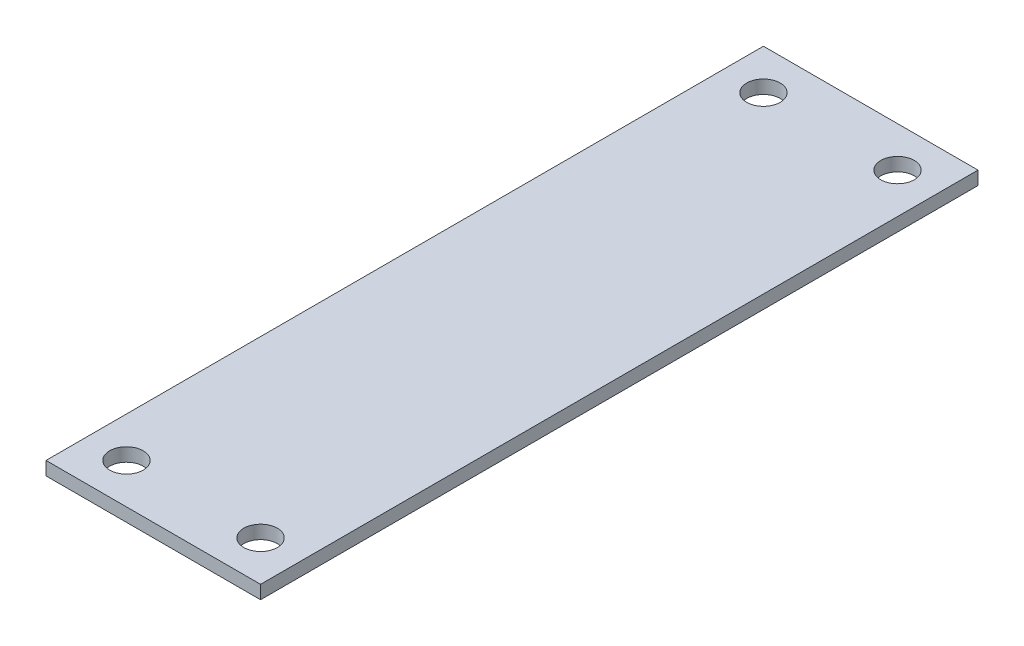
ISO-10303-21;
HEADER;
FILE_DESCRIPTION(('STEP AP214'),'2;1');
FILE_NAME('part.step','',(''),(''),'','','');
FILE_SCHEMA(('AUTOMOTIVE_DESIGN { 1 0 10303 214 1 1 1 1 }'));
ENDSEC;
DATA;
#1=APPLICATION_CONTEXT('core data for automotive mechanical design processes');
#2=APPLICATION_PROTOCOL_DEFINITION('international standard','automotive_design',2000,#1);
#3=PRODUCT_CONTEXT('',#1,'mechanical');
#4=PRODUCT('Part','Part','',(#3));
#5=PRODUCT_RELATED_PRODUCT_CATEGORY('part','',(#4));
#6=PRODUCT_DEFINITION_FORMATION('','',#4);
#7=PRODUCT_DEFINITION_CONTEXT('part definition',#1,'design');
#8=PRODUCT_DEFINITION('design','',#6,#7);
#9=PRODUCT_DEFINITION_SHAPE('','',#8);
#10=(LENGTH_UNIT() NAMED_UNIT(*) SI_UNIT(.MILLI.,.METRE.));
#11=(NAMED_UNIT(*) PLANE_ANGLE_UNIT() SI_UNIT($,.RADIAN.));
#12=(NAMED_UNIT(*) SI_UNIT($,.STERADIAN.) SOLID_ANGLE_UNIT());
#13=UNCERTAINTY_MEASURE_WITH_UNIT(LENGTH_MEASURE(1.E-05),#10,'distance_accuracy_value','');
#14=(GEOMETRIC_REPRESENTATION_CONTEXT(3) GLOBAL_UNCERTAINTY_ASSIGNED_CONTEXT((#13)) GLOBAL_UNIT_ASSIGNED_CONTEXT((#10,
#11,#12)) REPRESENTATION_CONTEXT('',''));
#15=CARTESIAN_POINT('',(0.,0.,0.));
#16=DIRECTION('',(0.,0.,1.));
#17=DIRECTION('',(1.,0.,0.));
#18=AXIS2_PLACEMENT_3D('',#15,#16,#17);
#19=CARTESIAN_POINT('',(0.,2.,0.));
#20=DIRECTION('',(0.,-1.,0.));
#21=DIRECTION('',(0.,0.,-1.));
#22=AXIS2_PLACEMENT_3D('',#19,#20,#21);
#23=PLANE('',#22);
#24=DIRECTION('',(-1.,0.,0.));
#25=VECTOR('',#24,1.);
#26=CARTESIAN_POINT('',(-16.1580950607641,2.,-92.7664237999109));
#27=LINE('',#26,#25);
#28=CARTESIAN_POINT('',(15.841904939236,2.,-92.7664237999109));
#29=VERTEX_POINT('',#28);
#30=CARTESIAN_POINT('',(-16.1580950607641,2.,-92.7664237999109));
#31=VERTEX_POINT('',#30);
#32=EDGE_CURVE('E86',#29,#31,#27,.T.);
#33=ORIENTED_EDGE('',*,*,#32,.T.);
#34=DIRECTION('',(0.,0.,1.));
#35=VECTOR('',#34,1.);
#36=CARTESIAN_POINT('',(-16.1580950607641,2.,-92.7664237999109));
#37=LINE('',#36,#35);
#38=CARTESIAN_POINT('',(-16.1580950607641,2.,14.2335762000891));
#39=VERTEX_POINT('',#38);
#40=EDGE_CURVE('E81',#31,#39,#37,.T.);
#41=ORIENTED_EDGE('',*,*,#40,.T.);
#42=DIRECTION('',(1.,0.,0.));
#43=VECTOR('',#42,1.);
#44=CARTESIAN_POINT('',(-16.1580950607641,2.,14.2335762000891));
#45=LINE('',#44,#43);
#46=CARTESIAN_POINT('',(15.841904939236,2.,14.2335762000891));
#47=VERTEX_POINT('',#46);
#48=EDGE_CURVE('E84',#39,#47,#45,.T.);
#49=ORIENTED_EDGE('',*,*,#48,.T.);
#50=DIRECTION('',(0.,0.,-1.));
#51=VECTOR('',#50,1.);
#52=CARTESIAN_POINT('',(15.841904939236,2.,-92.7664237999109));
#53=LINE('',#52,#51);
#54=EDGE_CURVE('E51',#47,#29,#53,.T.);
#55=ORIENTED_EDGE('',*,*,#54,.T.);
#56=EDGE_LOOP('',(#33,#41,#49,#55));
#57=FACE_BOUND('',#56,.T.);
#58=CARTESIAN_POINT('',(-10.1580950607641,2.,-86.7664237999109));
#59=DIRECTION('',(0.,1.,0.));
#60=DIRECTION('',(0.,0.,1.));
#61=AXIS2_PLACEMENT_3D('',#58,#59,#60);
#62=CIRCLE('',#61,2.5);
#63=CARTESIAN_POINT('',(-10.1580950607641,2.,-84.2664237999109));
#64=VERTEX_POINT('',#63);
#65=EDGE_CURVE('E101',#64,#64,#62,.T.);
#66=ORIENTED_EDGE('',*,*,#65,.F.);
#67=EDGE_LOOP('',(#66));
#68=FACE_BOUND('',#67,.T.);
#69=CARTESIAN_POINT('',(9.84190493923596,2.,-86.7664237999109));
#70=DIRECTION('',(0.,1.,0.));
#71=DIRECTION('',(0.,0.,1.));
#72=AXIS2_PLACEMENT_3D('',#69,#70,#71);
#73=CIRCLE('',#72,2.5);
#74=CARTESIAN_POINT('',(9.84190493923596,2.,-84.2664237999109));
#75=VERTEX_POINT('',#74);
#76=EDGE_CURVE('E116',#75,#75,#73,.T.);
#77=ORIENTED_EDGE('',*,*,#76,.F.);
#78=EDGE_LOOP('',(#77));
#79=FACE_BOUND('',#78,.T.);
#80=CARTESIAN_POINT('',(-10.158095060764,2.,8.2335762000891));
#81=DIRECTION('',(0.,1.,0.));
#82=DIRECTION('',(0.,0.,1.));
#83=AXIS2_PLACEMENT_3D('',#80,#81,#82);
#84=CIRCLE('',#83,2.5);
#85=CARTESIAN_POINT('',(-10.158095060764,2.,10.7335762000891));
#86=VERTEX_POINT('',#85);
#87=EDGE_CURVE('E122',#86,#86,#84,.T.);
#88=ORIENTED_EDGE('',*,*,#87,.F.);
#89=EDGE_LOOP('',(#88));
#90=FACE_BOUND('',#89,.T.);
#91=CARTESIAN_POINT('',(9.84190493923596,2.,8.2335762000891));
#92=DIRECTION('',(0.,1.,0.));
#93=DIRECTION('',(0.,0.,1.));
#94=AXIS2_PLACEMENT_3D('',#91,#92,#93);
#95=CIRCLE('',#94,2.5);
#96=CARTESIAN_POINT('',(9.84190493923596,2.,10.7335762000891));
#97=VERTEX_POINT('',#96);
#98=EDGE_CURVE('E128',#97,#97,#95,.T.);
#99=ORIENTED_EDGE('',*,*,#98,.F.);
#100=EDGE_LOOP('',(#99));
#101=FACE_BOUND('',#100,.T.);
#102=ADVANCED_FACE('F34',(#57,#68,#79,#90,#101),#23,.F.);
#103=CARTESIAN_POINT('',(0.,0.,0.));
#104=DIRECTION('',(0.,-1.,0.));
#105=DIRECTION('',(0.,0.,-1.));
#106=AXIS2_PLACEMENT_3D('',#103,#104,#105);
#107=PLANE('',#106);
#108=CARTESIAN_POINT('',(-10.158095060764,0.,8.2335762000891));
#109=DIRECTION('',(0.,1.,0.));
#110=DIRECTION('',(0.,0.,1.));
#111=AXIS2_PLACEMENT_3D('',#108,#109,#110);
#112=CIRCLE('',#111,2.5);
#113=CARTESIAN_POINT('',(-10.158095060764,0.,10.7335762000891));
#114=VERTEX_POINT('',#113);
#115=EDGE_CURVE('E125',#114,#114,#112,.T.);
#116=ORIENTED_EDGE('',*,*,#115,.T.);
#117=EDGE_LOOP('',(#116));
#118=FACE_BOUND('',#117,.T.);
#119=CARTESIAN_POINT('',(-10.1580950607641,0.,-86.7664237999109));
#120=DIRECTION('',(0.,1.,0.));
#121=DIRECTION('',(0.,0.,1.));
#122=AXIS2_PLACEMENT_3D('',#119,#120,#121);
#123=CIRCLE('',#122,2.5);
#124=CARTESIAN_POINT('',(-10.1580950607641,0.,-84.2664237999109));
#125=VERTEX_POINT('',#124);
#126=EDGE_CURVE('E113',#125,#125,#123,.T.);
#127=ORIENTED_EDGE('',*,*,#126,.T.);
#128=EDGE_LOOP('',(#127));
#129=FACE_BOUND('',#128,.T.);
#130=DIRECTION('',(-1.,0.,0.));
#131=VECTOR('',#130,1.);
#132=CARTESIAN_POINT('',(-16.1580950607641,0.,-92.7664237999109));
#133=LINE('',#132,#131);
#134=CARTESIAN_POINT('',(15.841904939236,0.,-92.7664237999109));
#135=VERTEX_POINT('',#134);
#136=CARTESIAN_POINT('',(-16.1580950607641,0.,-92.7664237999109));
#137=VERTEX_POINT('',#136);
#138=EDGE_CURVE('E98',#135,#137,#133,.T.);
#139=ORIENTED_EDGE('',*,*,#138,.F.);
#140=DIRECTION('',(0.,0.,-1.));
#141=VECTOR('',#140,1.);
#142=CARTESIAN_POINT('',(15.841904939236,0.,-92.7664237999109));
#143=LINE('',#142,#141);
#144=CARTESIAN_POINT('',(15.841904939236,0.,14.2335762000891));
#145=VERTEX_POINT('',#144);
#146=EDGE_CURVE('E74',#145,#135,#143,.T.);
#147=ORIENTED_EDGE('',*,*,#146,.F.);
#148=DIRECTION('',(1.,0.,0.));
#149=VECTOR('',#148,1.);
#150=CARTESIAN_POINT('',(-16.1580950607641,0.,14.2335762000891));
#151=LINE('',#150,#149);
#152=CARTESIAN_POINT('',(-16.1580950607641,0.,14.2335762000891));
#153=VERTEX_POINT('',#152);
#154=EDGE_CURVE('E68',#153,#145,#151,.T.);
#155=ORIENTED_EDGE('',*,*,#154,.F.);
#156=DIRECTION('',(0.,0.,1.));
#157=VECTOR('',#156,1.);
#158=CARTESIAN_POINT('',(-16.1580950607641,0.,-92.7664237999109));
#159=LINE('',#158,#157);
#160=EDGE_CURVE('E90',#137,#153,#159,.T.);
#161=ORIENTED_EDGE('',*,*,#160,.F.);
#162=EDGE_LOOP('',(#139,#147,#155,#161));
#163=FACE_BOUND('',#162,.T.);
#164=CARTESIAN_POINT('',(9.84190493923596,0.,-86.7664237999109));
#165=DIRECTION('',(0.,1.,0.));
#166=DIRECTION('',(0.,0.,1.));
#167=AXIS2_PLACEMENT_3D('',#164,#165,#166);
#168=CIRCLE('',#167,2.5);
#169=CARTESIAN_POINT('',(9.84190493923596,0.,-84.2664237999109));
#170=VERTEX_POINT('',#169);
#171=EDGE_CURVE('E119',#170,#170,#168,.T.);
#172=ORIENTED_EDGE('',*,*,#171,.T.);
#173=EDGE_LOOP('',(#172));
#174=FACE_BOUND('',#173,.T.);
#175=CARTESIAN_POINT('',(9.84190493923596,0.,8.2335762000891));
#176=DIRECTION('',(0.,1.,0.));
#177=DIRECTION('',(0.,0.,1.));
#178=AXIS2_PLACEMENT_3D('',#175,#176,#177);
#179=CIRCLE('',#178,2.5);
#180=CARTESIAN_POINT('',(9.84190493923596,0.,10.7335762000891));
#181=VERTEX_POINT('',#180);
#182=EDGE_CURVE('E131',#181,#181,#179,.T.);
#183=ORIENTED_EDGE('',*,*,#182,.T.);
#184=EDGE_LOOP('',(#183));
#185=FACE_BOUND('',#184,.T.);
#186=ADVANCED_FACE('F109',(#118,#129,#163,#174,#185),#107,.T.);
#187=CARTESIAN_POINT('',(-16.1580950607641,2.,-92.7664237999109));
#188=DIRECTION('',(0.,0.,1.));
#189=DIRECTION('',(1.,0.,0.));
#190=AXIS2_PLACEMENT_3D('',#187,#188,#189);
#191=PLANE('',#190);
#192=ORIENTED_EDGE('',*,*,#138,.T.);
#193=DIRECTION('',(0.,-1.,0.));
#194=VECTOR('',#193,1.);
#195=CARTESIAN_POINT('',(-16.1580950607641,2.,-92.7664237999109));
#196=LINE('',#195,#194);
#197=EDGE_CURVE('E11',#31,#137,#196,.T.);
#198=ORIENTED_EDGE('',*,*,#197,.F.);
#199=ORIENTED_EDGE('',*,*,#32,.F.);
#200=DIRECTION('',(0.,-1.,0.));
#201=VECTOR('',#200,1.);
#202=CARTESIAN_POINT('',(15.841904939236,2.,-92.7664237999109));
#203=LINE('',#202,#201);
#204=EDGE_CURVE('E94',#29,#135,#203,.T.);
#205=ORIENTED_EDGE('',*,*,#204,.T.);
#206=EDGE_LOOP('',(#192,#198,#199,#205));
#207=FACE_BOUND('',#206,.T.);
#208=ADVANCED_FACE('F36',(#207),#191,.F.);
#209=CARTESIAN_POINT('',(-16.1580950607641,2.,-92.7664237999109));
#210=DIRECTION('',(1.,0.,0.));
#211=DIRECTION('',(0.,0.,-1.));
#212=AXIS2_PLACEMENT_3D('',#209,#210,#211);
#213=PLANE('',#212);
#214=ORIENTED_EDGE('',*,*,#160,.T.);
#215=DIRECTION('',(0.,-1.,0.));
#216=VECTOR('',#215,1.);
#217=CARTESIAN_POINT('',(-16.1580950607641,2.,14.2335762000891));
#218=LINE('',#217,#216);
#219=EDGE_CURVE('E43',#39,#153,#218,.T.);
#220=ORIENTED_EDGE('',*,*,#219,.F.);
#221=ORIENTED_EDGE('',*,*,#40,.F.);
#222=ORIENTED_EDGE('',*,*,#197,.T.);
#223=EDGE_LOOP('',(#214,#220,#221,#222));
#224=FACE_BOUND('',#223,.T.);
#225=ADVANCED_FACE('F89',(#224),#213,.F.);
#226=CARTESIAN_POINT('',(-16.1580950607641,2.,14.2335762000891));
#227=DIRECTION('',(0.,0.,-1.));
#228=DIRECTION('',(-1.,0.,0.));
#229=AXIS2_PLACEMENT_3D('',#226,#227,#228);
#230=PLANE('',#229);
#231=ORIENTED_EDGE('',*,*,#154,.T.);
#232=DIRECTION('',(0.,-1.,0.));
#233=VECTOR('',#232,1.);
#234=CARTESIAN_POINT('',(15.841904939236,2.,14.2335762000891));
#235=LINE('',#234,#233);
#236=EDGE_CURVE('E91',#47,#145,#235,.T.);
#237=ORIENTED_EDGE('',*,*,#236,.F.);
#238=ORIENTED_EDGE('',*,*,#48,.F.);
#239=ORIENTED_EDGE('',*,*,#219,.T.);
#240=EDGE_LOOP('',(#231,#237,#238,#239));
#241=FACE_BOUND('',#240,.T.);
#242=ADVANCED_FACE('F92',(#241),#230,.F.);
#243=CARTESIAN_POINT('',(15.841904939236,2.,-92.7664237999109));
#244=DIRECTION('',(-1.,0.,0.));
#245=DIRECTION('',(0.,0.,1.));
#246=AXIS2_PLACEMENT_3D('',#243,#244,#245);
#247=PLANE('',#246);
#248=ORIENTED_EDGE('',*,*,#146,.T.);
#249=ORIENTED_EDGE('',*,*,#204,.F.);
#250=ORIENTED_EDGE('',*,*,#54,.F.);
#251=ORIENTED_EDGE('',*,*,#236,.T.);
#252=EDGE_LOOP('',(#248,#249,#250,#251));
#253=FACE_BOUND('',#252,.T.);
#254=ADVANCED_FACE('F106',(#253),#247,.F.);
#255=CARTESIAN_POINT('',(-10.1580950607641,2.,-86.7664237999109));
#256=DIRECTION('',(0.,-1.,0.));
#257=DIRECTION('',(0.,0.,-1.));
#258=AXIS2_PLACEMENT_3D('',#255,#256,#257);
#259=CYLINDRICAL_SURFACE('',#258,2.5);
#260=ORIENTED_EDGE('',*,*,#65,.T.);
#261=EDGE_LOOP('',(#260));
#262=FACE_BOUND('',#261,.T.);
#263=ORIENTED_EDGE('',*,*,#126,.F.);
#264=EDGE_LOOP('',(#263));
#265=FACE_BOUND('',#264,.T.);
#266=ADVANCED_FACE('F148',(#262,#265),#259,.F.);
#267=CARTESIAN_POINT('',(9.84190493923596,2.,-86.7664237999109));
#268=DIRECTION('',(0.,-1.,0.));
#269=DIRECTION('',(0.,0.,-1.));
#270=AXIS2_PLACEMENT_3D('',#267,#268,#269);
#271=CYLINDRICAL_SURFACE('',#270,2.5);
#272=ORIENTED_EDGE('',*,*,#76,.T.);
#273=EDGE_LOOP('',(#272));
#274=FACE_BOUND('',#273,.T.);
#275=ORIENTED_EDGE('',*,*,#171,.F.);
#276=EDGE_LOOP('',(#275));
#277=FACE_BOUND('',#276,.T.);
#278=ADVANCED_FACE('F194',(#274,#277),#271,.F.);
#279=CARTESIAN_POINT('',(-10.158095060764,2.,8.2335762000891));
#280=DIRECTION('',(0.,-1.,0.));
#281=DIRECTION('',(0.,0.,-1.));
#282=AXIS2_PLACEMENT_3D('',#279,#280,#281);
#283=CYLINDRICAL_SURFACE('',#282,2.5);
#284=ORIENTED_EDGE('',*,*,#87,.T.);
#285=EDGE_LOOP('',(#284));
#286=FACE_BOUND('',#285,.T.);
#287=ORIENTED_EDGE('',*,*,#115,.F.);
#288=EDGE_LOOP('',(#287));
#289=FACE_BOUND('',#288,.T.);
#290=ADVANCED_FACE('F202',(#286,#289),#283,.F.);
#291=CARTESIAN_POINT('',(9.84190493923596,2.,8.2335762000891));
#292=DIRECTION('',(0.,-1.,0.));
#293=DIRECTION('',(0.,0.,-1.));
#294=AXIS2_PLACEMENT_3D('',#291,#292,#293);
#295=CYLINDRICAL_SURFACE('',#294,2.5);
#296=ORIENTED_EDGE('',*,*,#98,.T.);
#297=EDGE_LOOP('',(#296));
#298=FACE_BOUND('',#297,.T.);
#299=ORIENTED_EDGE('',*,*,#182,.F.);
#300=EDGE_LOOP('',(#299));
#301=FACE_BOUND('',#300,.T.);
#302=ADVANCED_FACE('F137',(#298,#301),#295,.F.);
#303=CLOSED_SHELL('',(#102,#186,#208,#225,#242,#254,#266,#278,#290,#302));
#304=MANIFOLD_SOLID_BREP('B2',#303);
#305=ADVANCED_BREP_SHAPE_REPRESENTATION('',(#18,#304),#14);
#306=SHAPE_DEFINITION_REPRESENTATION(#9,#305);
ENDSEC;
END-ISO-10303-21;
